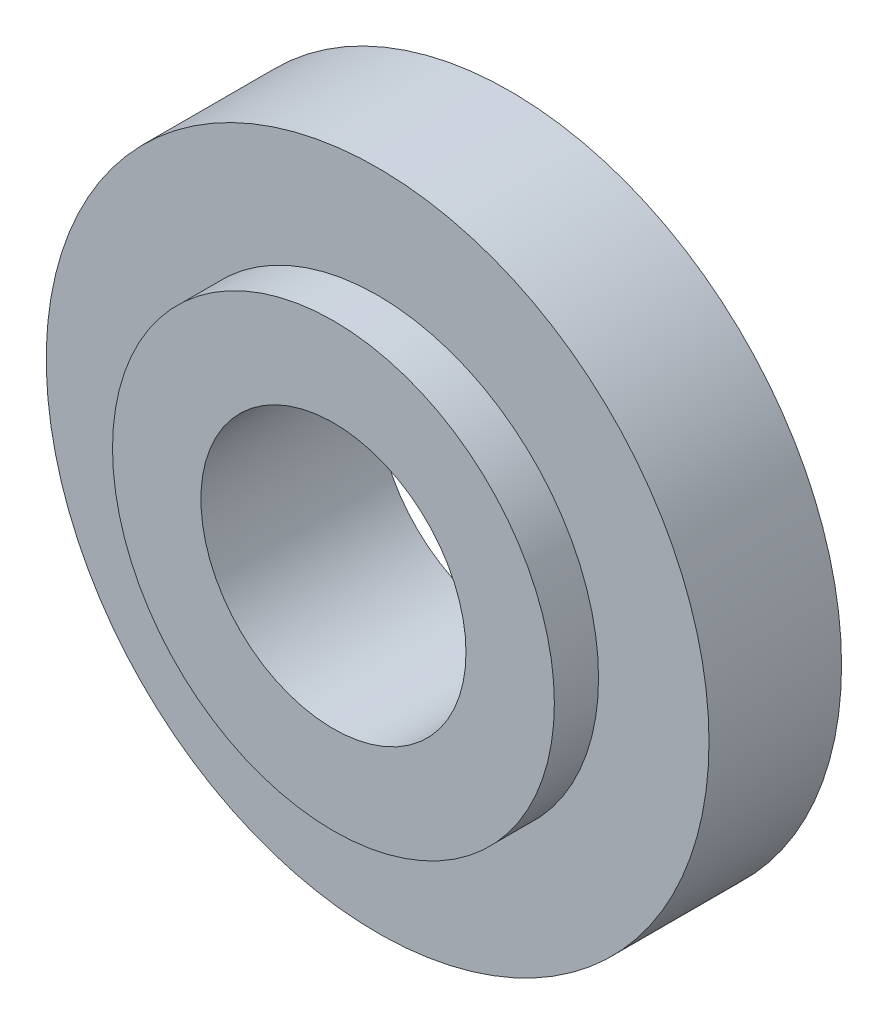
ISO-10303-21;
HEADER;
FILE_DESCRIPTION(('STEP AP214'),'2;1');
FILE_NAME('part.step','',(''),(''),'','','');
FILE_SCHEMA(('AUTOMOTIVE_DESIGN { 1 0 10303 214 1 1 1 1 }'));
ENDSEC;
DATA;
#1=APPLICATION_CONTEXT('core data for automotive mechanical design processes');
#2=APPLICATION_PROTOCOL_DEFINITION('international standard','automotive_design',2000,#1);
#3=PRODUCT_CONTEXT('',#1,'mechanical');
#4=PRODUCT('Part','Part','',(#3));
#5=PRODUCT_RELATED_PRODUCT_CATEGORY('part','',(#4));
#6=PRODUCT_DEFINITION_FORMATION('','',#4);
#7=PRODUCT_DEFINITION_CONTEXT('part definition',#1,'design');
#8=PRODUCT_DEFINITION('design','',#6,#7);
#9=PRODUCT_DEFINITION_SHAPE('','',#8);
#10=(LENGTH_UNIT() NAMED_UNIT(*) SI_UNIT(.MILLI.,.METRE.));
#11=(NAMED_UNIT(*) PLANE_ANGLE_UNIT() SI_UNIT($,.RADIAN.));
#12=(NAMED_UNIT(*) SI_UNIT($,.STERADIAN.) SOLID_ANGLE_UNIT());
#13=UNCERTAINTY_MEASURE_WITH_UNIT(LENGTH_MEASURE(1.E-05),#10,'distance_accuracy_value','');
#14=(GEOMETRIC_REPRESENTATION_CONTEXT(3) GLOBAL_UNCERTAINTY_ASSIGNED_CONTEXT((#13)) GLOBAL_UNIT_ASSIGNED_CONTEXT((#10,
#11,#12)) REPRESENTATION_CONTEXT('',''));
#15=CARTESIAN_POINT('',(0.,0.,0.));
#16=DIRECTION('',(0.,0.,1.));
#17=DIRECTION('',(1.,0.,0.));
#18=AXIS2_PLACEMENT_3D('',#15,#16,#17);
#19=CARTESIAN_POINT('',(0.,0.,1.5));
#20=DIRECTION('',(0.,0.,-1.));
#21=DIRECTION('',(-1.,0.,0.));
#22=AXIS2_PLACEMENT_3D('',#19,#20,#21);
#23=CYLINDRICAL_SURFACE('',#22,3.75);
#24=CARTESIAN_POINT('',(0.,0.,1.5));
#25=DIRECTION('',(0.,0.,1.));
#26=DIRECTION('',(1.,0.,0.));
#27=AXIS2_PLACEMENT_3D('',#24,#25,#26);
#28=CIRCLE('',#27,3.75);
#29=CARTESIAN_POINT('',(3.75,0.,1.5));
#30=VERTEX_POINT('',#29);
#31=EDGE_CURVE('E39',#30,#30,#28,.T.);
#32=ORIENTED_EDGE('',*,*,#31,.F.);
#33=EDGE_LOOP('',(#32));
#34=FACE_BOUND('',#33,.T.);
#35=CARTESIAN_POINT('',(0.,0.,0.));
#36=DIRECTION('',(0.,0.,1.));
#37=DIRECTION('',(1.,0.,0.));
#38=AXIS2_PLACEMENT_3D('',#35,#36,#37);
#39=CIRCLE('',#38,3.75);
#40=CARTESIAN_POINT('',(3.75,0.,0.));
#41=VERTEX_POINT('',#40);
#42=EDGE_CURVE('E35',#41,#41,#39,.T.);
#43=ORIENTED_EDGE('',*,*,#42,.T.);
#44=EDGE_LOOP('',(#43));
#45=FACE_BOUND('',#44,.T.);
#46=ADVANCED_FACE('F32',(#34,#45),#23,.T.);
#47=CARTESIAN_POINT('',(0.,0.,1.5));
#48=DIRECTION('',(0.,0.,1.));
#49=DIRECTION('',(1.,0.,0.));
#50=AXIS2_PLACEMENT_3D('',#47,#48,#49);
#51=PLANE('',#50);
#52=CARTESIAN_POINT('',(0.,0.,1.5));
#53=DIRECTION('',(0.,0.,1.));
#54=DIRECTION('',(1.,0.,0.));
#55=AXIS2_PLACEMENT_3D('',#52,#53,#54);
#56=CIRCLE('',#55,2.5);
#57=CARTESIAN_POINT('',(2.5,0.,1.5));
#58=VERTEX_POINT('',#57);
#59=EDGE_CURVE('E10',#58,#58,#56,.T.);
#60=ORIENTED_EDGE('',*,*,#59,.F.);
#61=EDGE_LOOP('',(#60));
#62=FACE_BOUND('',#61,.T.);
#63=ORIENTED_EDGE('',*,*,#31,.T.);
#64=EDGE_LOOP('',(#63));
#65=FACE_BOUND('',#64,.T.);
#66=ADVANCED_FACE('F71',(#62,#65),#51,.T.);
#67=CARTESIAN_POINT('',(0.,0.,0.));
#68=DIRECTION('',(0.,0.,1.));
#69=DIRECTION('',(1.,0.,0.));
#70=AXIS2_PLACEMENT_3D('',#67,#68,#69);
#71=PLANE('',#70);
#72=CARTESIAN_POINT('',(0.,0.,0.));
#73=DIRECTION('',(0.,0.,1.));
#74=DIRECTION('',(1.,0.,0.));
#75=AXIS2_PLACEMENT_3D('',#72,#73,#74);
#76=CIRCLE('',#75,1.5);
#77=CARTESIAN_POINT('',(1.5,0.,0.));
#78=VERTEX_POINT('',#77);
#79=EDGE_CURVE('E48',#78,#78,#76,.T.);
#80=ORIENTED_EDGE('',*,*,#79,.T.);
#81=EDGE_LOOP('',(#80));
#82=FACE_BOUND('',#81,.T.);
#83=ORIENTED_EDGE('',*,*,#42,.F.);
#84=EDGE_LOOP('',(#83));
#85=FACE_BOUND('',#84,.T.);
#86=ADVANCED_FACE('F66',(#82,#85),#71,.F.);
#87=CARTESIAN_POINT('',(0.,0.,2.));
#88=DIRECTION('',(0.,0.,-1.));
#89=DIRECTION('',(-1.,0.,0.));
#90=AXIS2_PLACEMENT_3D('',#87,#88,#89);
#91=CYLINDRICAL_SURFACE('',#90,2.5);
#92=CARTESIAN_POINT('',(0.,0.,2.));
#93=DIRECTION('',(0.,0.,1.));
#94=DIRECTION('',(1.,0.,0.));
#95=AXIS2_PLACEMENT_3D('',#92,#93,#94);
#96=CIRCLE('',#95,2.5);
#97=CARTESIAN_POINT('',(2.5,0.,2.));
#98=VERTEX_POINT('',#97);
#99=EDGE_CURVE('E45',#98,#98,#96,.T.);
#100=ORIENTED_EDGE('',*,*,#99,.F.);
#101=EDGE_LOOP('',(#100));
#102=FACE_BOUND('',#101,.T.);
#103=ORIENTED_EDGE('',*,*,#59,.T.);
#104=EDGE_LOOP('',(#103));
#105=FACE_BOUND('',#104,.T.);
#106=ADVANCED_FACE('F61',(#102,#105),#91,.T.);
#107=CARTESIAN_POINT('',(0.,0.,2.));
#108=DIRECTION('',(0.,0.,1.));
#109=DIRECTION('',(1.,0.,0.));
#110=AXIS2_PLACEMENT_3D('',#107,#108,#109);
#111=PLANE('',#110);
#112=CARTESIAN_POINT('',(0.,0.,2.));
#113=DIRECTION('',(0.,0.,1.));
#114=DIRECTION('',(1.,0.,0.));
#115=AXIS2_PLACEMENT_3D('',#112,#113,#114);
#116=CIRCLE('',#115,1.5);
#117=CARTESIAN_POINT('',(1.5,0.,2.));
#118=VERTEX_POINT('',#117);
#119=EDGE_CURVE('E51',#118,#118,#116,.T.);
#120=ORIENTED_EDGE('',*,*,#119,.F.);
#121=EDGE_LOOP('',(#120));
#122=FACE_BOUND('',#121,.T.);
#123=ORIENTED_EDGE('',*,*,#99,.T.);
#124=EDGE_LOOP('',(#123));
#125=FACE_BOUND('',#124,.T.);
#126=ADVANCED_FACE('F58',(#122,#125),#111,.T.);
#127=CARTESIAN_POINT('',(0.,0.,-2.5));
#128=DIRECTION('',(0.,0.,1.));
#129=DIRECTION('',(1.,0.,0.));
#130=AXIS2_PLACEMENT_3D('',#127,#128,#129);
#131=CYLINDRICAL_SURFACE('',#130,1.5);
#132=ORIENTED_EDGE('',*,*,#119,.T.);
#133=EDGE_LOOP('',(#132));
#134=FACE_BOUND('',#133,.T.);
#135=ORIENTED_EDGE('',*,*,#79,.F.);
#136=EDGE_LOOP('',(#135));
#137=FACE_BOUND('',#136,.T.);
#138=ADVANCED_FACE('F55',(#134,#137),#131,.F.);
#139=CLOSED_SHELL('',(#46,#66,#86,#106,#126,#138));
#140=MANIFOLD_SOLID_BREP('B2',#139);
#141=ADVANCED_BREP_SHAPE_REPRESENTATION('',(#18,#140),#14);
#142=SHAPE_DEFINITION_REPRESENTATION(#9,#141);
ENDSEC;
END-ISO-10303-21;
